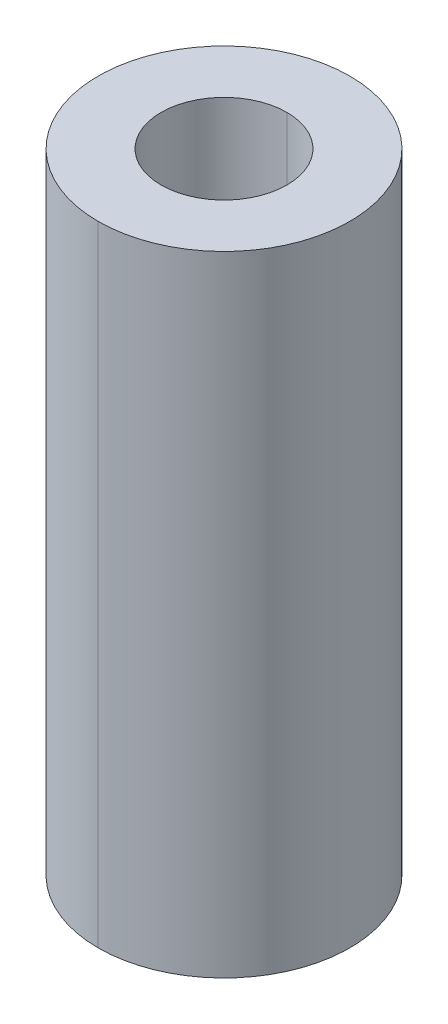
ISO-10303-21;
HEADER;
FILE_DESCRIPTION(('STEP AP214'),'2;1');
FILE_NAME('part.step','',(''),(''),'','','');
FILE_SCHEMA(('AUTOMOTIVE_DESIGN { 1 0 10303 214 1 1 1 1 }'));
ENDSEC;
DATA;
#1=APPLICATION_CONTEXT('core data for automotive mechanical design processes');
#2=APPLICATION_PROTOCOL_DEFINITION('international standard','automotive_design',2000,#1);
#3=PRODUCT_CONTEXT('',#1,'mechanical');
#4=PRODUCT('Part','Part','',(#3));
#5=PRODUCT_RELATED_PRODUCT_CATEGORY('part','',(#4));
#6=PRODUCT_DEFINITION_FORMATION('','',#4);
#7=PRODUCT_DEFINITION_CONTEXT('part definition',#1,'design');
#8=PRODUCT_DEFINITION('design','',#6,#7);
#9=PRODUCT_DEFINITION_SHAPE('','',#8);
#10=(LENGTH_UNIT() NAMED_UNIT(*) SI_UNIT(.MILLI.,.METRE.));
#11=(NAMED_UNIT(*) PLANE_ANGLE_UNIT() SI_UNIT($,.RADIAN.));
#12=(NAMED_UNIT(*) SI_UNIT($,.STERADIAN.) SOLID_ANGLE_UNIT());
#13=UNCERTAINTY_MEASURE_WITH_UNIT(LENGTH_MEASURE(1.E-05),#10,'distance_accuracy_value','');
#14=(GEOMETRIC_REPRESENTATION_CONTEXT(3) GLOBAL_UNCERTAINTY_ASSIGNED_CONTEXT((#13)) GLOBAL_UNIT_ASSIGNED_CONTEXT((#10,
#11,#12)) REPRESENTATION_CONTEXT('',''));
#15=CARTESIAN_POINT('',(0.,0.,0.));
#16=DIRECTION('',(0.,0.,1.));
#17=DIRECTION('',(1.,0.,0.));
#18=AXIS2_PLACEMENT_3D('',#15,#16,#17);
#19=CARTESIAN_POINT('',(0.,15.,0.));
#20=DIRECTION('',(0.,-1.,0.));
#21=DIRECTION('',(0.,0.,-1.));
#22=AXIS2_PLACEMENT_3D('',#19,#20,#21);
#23=CYLINDRICAL_SURFACE('',#22,1.5);
#24=DIRECTION('',(0.,-1.,0.));
#25=VECTOR('',#24,1.);
#26=CARTESIAN_POINT('',(0.,15.,1.5));
#27=LINE('',#26,#25);
#28=CARTESIAN_POINT('',(0.,15.,1.5));
#29=VERTEX_POINT('',#28);
#30=CARTESIAN_POINT('',(0.,0.,1.5));
#31=VERTEX_POINT('',#30);
#32=EDGE_CURVE('E77',#29,#31,#27,.T.);
#33=ORIENTED_EDGE('',*,*,#32,.F.);
#34=CARTESIAN_POINT('',(0.,15.,0.));
#35=DIRECTION('',(0.,1.,0.));
#36=DIRECTION('',(0.,0.,1.));
#37=AXIS2_PLACEMENT_3D('',#34,#35,#36);
#38=CIRCLE('',#37,1.5);
#39=CARTESIAN_POINT('',(0.,15.,-1.5));
#40=VERTEX_POINT('',#39);
#41=EDGE_CURVE('E72',#29,#40,#38,.T.);
#42=ORIENTED_EDGE('',*,*,#41,.T.);
#43=DIRECTION('',(0.,-1.,0.));
#44=VECTOR('',#43,1.);
#45=CARTESIAN_POINT('',(0.,15.,-1.5));
#46=LINE('',#45,#44);
#47=CARTESIAN_POINT('',(0.,0.,-1.5));
#48=VERTEX_POINT('',#47);
#49=EDGE_CURVE('E74',#40,#48,#46,.T.);
#50=ORIENTED_EDGE('',*,*,#49,.T.);
#51=CARTESIAN_POINT('',(0.,0.,0.));
#52=DIRECTION('',(0.,1.,0.));
#53=DIRECTION('',(0.,0.,1.));
#54=AXIS2_PLACEMENT_3D('',#51,#52,#53);
#55=CIRCLE('',#54,1.5);
#56=EDGE_CURVE('E11',#31,#48,#55,.T.);
#57=ORIENTED_EDGE('',*,*,#56,.F.);
#58=EDGE_LOOP('',(#33,#42,#50,#57));
#59=FACE_BOUND('',#58,.T.);
#60=ADVANCED_FACE('F18',(#59),#23,.F.);
#61=CARTESIAN_POINT('',(0.,15.,0.));
#62=DIRECTION('',(0.,-1.,0.));
#63=DIRECTION('',(0.,0.,-1.));
#64=AXIS2_PLACEMENT_3D('',#61,#62,#63);
#65=CYLINDRICAL_SURFACE('',#64,3.);
#66=DIRECTION('',(0.,-1.,0.));
#67=VECTOR('',#66,1.);
#68=CARTESIAN_POINT('',(0.,15.,3.));
#69=LINE('',#68,#67);
#70=CARTESIAN_POINT('',(0.,15.,3.));
#71=VERTEX_POINT('',#70);
#72=CARTESIAN_POINT('',(0.,0.,3.));
#73=VERTEX_POINT('',#72);
#74=EDGE_CURVE('E105',#71,#73,#69,.T.);
#75=ORIENTED_EDGE('',*,*,#74,.F.);
#76=CARTESIAN_POINT('',(0.,15.,0.));
#77=DIRECTION('',(0.,1.,0.));
#78=DIRECTION('',(0.,0.,1.));
#79=AXIS2_PLACEMENT_3D('',#76,#77,#78);
#80=CIRCLE('',#79,3.);
#81=CARTESIAN_POINT('',(0.,15.,-3.));
#82=VERTEX_POINT('',#81);
#83=EDGE_CURVE('E82',#82,#71,#80,.T.);
#84=ORIENTED_EDGE('',*,*,#83,.F.);
#85=DIRECTION('',(0.,-1.,0.));
#86=VECTOR('',#85,1.);
#87=CARTESIAN_POINT('',(0.,15.,-3.));
#88=LINE('',#87,#86);
#89=CARTESIAN_POINT('',(0.,0.,-3.));
#90=VERTEX_POINT('',#89);
#91=EDGE_CURVE('E104',#82,#90,#88,.T.);
#92=ORIENTED_EDGE('',*,*,#91,.T.);
#93=CARTESIAN_POINT('',(0.,0.,0.));
#94=DIRECTION('',(0.,1.,0.));
#95=DIRECTION('',(0.,0.,1.));
#96=AXIS2_PLACEMENT_3D('',#93,#94,#95);
#97=CIRCLE('',#96,3.);
#98=EDGE_CURVE('E26',#90,#73,#97,.T.);
#99=ORIENTED_EDGE('',*,*,#98,.T.);
#100=EDGE_LOOP('',(#75,#84,#92,#99));
#101=FACE_BOUND('',#100,.T.);
#102=ADVANCED_FACE('F123',(#101),#65,.T.);
#103=CARTESIAN_POINT('',(0.,0.,0.));
#104=DIRECTION('',(0.,1.,0.));
#105=DIRECTION('',(1.,0.,0.));
#106=AXIS2_PLACEMENT_3D('',#103,#104,#105);
#107=PLANE('',#106);
#108=CARTESIAN_POINT('',(0.,0.,0.));
#109=DIRECTION('',(0.,1.,0.));
#110=DIRECTION('',(0.,0.,1.));
#111=AXIS2_PLACEMENT_3D('',#108,#109,#110);
#112=CIRCLE('',#111,1.5);
#113=EDGE_CURVE('E87',#48,#31,#112,.T.);
#114=ORIENTED_EDGE('',*,*,#113,.T.);
#115=ORIENTED_EDGE('',*,*,#56,.T.);
#116=EDGE_LOOP('',(#114,#115));
#117=FACE_BOUND('',#116,.T.);
#118=ORIENTED_EDGE('',*,*,#98,.F.);
#119=CARTESIAN_POINT('',(0.,0.,0.));
#120=DIRECTION('',(0.,1.,0.));
#121=DIRECTION('',(0.,0.,1.));
#122=AXIS2_PLACEMENT_3D('',#119,#120,#121);
#123=CIRCLE('',#122,3.);
#124=EDGE_CURVE('E101',#73,#90,#123,.T.);
#125=ORIENTED_EDGE('',*,*,#124,.F.);
#126=EDGE_LOOP('',(#118,#125));
#127=FACE_BOUND('',#126,.T.);
#128=ADVANCED_FACE('F126',(#117,#127),#107,.F.);
#129=CARTESIAN_POINT('',(0.,15.,0.));
#130=DIRECTION('',(0.,1.,0.));
#131=DIRECTION('',(1.,0.,0.));
#132=AXIS2_PLACEMENT_3D('',#129,#130,#131);
#133=PLANE('',#132);
#134=CARTESIAN_POINT('',(0.,15.,0.));
#135=DIRECTION('',(0.,1.,0.));
#136=DIRECTION('',(0.,0.,1.));
#137=AXIS2_PLACEMENT_3D('',#134,#135,#136);
#138=CIRCLE('',#137,1.5);
#139=EDGE_CURVE('E85',#40,#29,#138,.T.);
#140=ORIENTED_EDGE('',*,*,#139,.F.);
#141=ORIENTED_EDGE('',*,*,#41,.F.);
#142=EDGE_LOOP('',(#140,#141));
#143=FACE_BOUND('',#142,.T.);
#144=ORIENTED_EDGE('',*,*,#83,.T.);
#145=CARTESIAN_POINT('',(0.,15.,0.));
#146=DIRECTION('',(0.,1.,0.));
#147=DIRECTION('',(0.,0.,1.));
#148=AXIS2_PLACEMENT_3D('',#145,#146,#147);
#149=CIRCLE('',#148,3.);
#150=EDGE_CURVE('E89',#71,#82,#149,.T.);
#151=ORIENTED_EDGE('',*,*,#150,.T.);
#152=EDGE_LOOP('',(#144,#151));
#153=FACE_BOUND('',#152,.T.);
#154=ADVANCED_FACE('F91',(#143,#153),#133,.T.);
#155=CARTESIAN_POINT('',(0.,15.,0.));
#156=DIRECTION('',(0.,-1.,0.));
#157=DIRECTION('',(0.,0.,-1.));
#158=AXIS2_PLACEMENT_3D('',#155,#156,#157);
#159=CYLINDRICAL_SURFACE('',#158,3.);
#160=ORIENTED_EDGE('',*,*,#150,.F.);
#161=ORIENTED_EDGE('',*,*,#74,.T.);
#162=ORIENTED_EDGE('',*,*,#124,.T.);
#163=ORIENTED_EDGE('',*,*,#91,.F.);
#164=EDGE_LOOP('',(#160,#161,#162,#163));
#165=FACE_BOUND('',#164,.T.);
#166=ADVANCED_FACE('F125',(#165),#159,.T.);
#167=CARTESIAN_POINT('',(0.,15.,0.));
#168=DIRECTION('',(0.,-1.,0.));
#169=DIRECTION('',(0.,0.,-1.));
#170=AXIS2_PLACEMENT_3D('',#167,#168,#169);
#171=CYLINDRICAL_SURFACE('',#170,1.5);
#172=ORIENTED_EDGE('',*,*,#139,.T.);
#173=ORIENTED_EDGE('',*,*,#32,.T.);
#174=ORIENTED_EDGE('',*,*,#113,.F.);
#175=ORIENTED_EDGE('',*,*,#49,.F.);
#176=EDGE_LOOP('',(#172,#173,#174,#175));
#177=FACE_BOUND('',#176,.T.);
#178=ADVANCED_FACE('F84',(#177),#171,.F.);
#179=CLOSED_SHELL('',(#60,#102,#128,#154,#166,#178));
#180=MANIFOLD_SOLID_BREP('B1',#179);
#181=ADVANCED_BREP_SHAPE_REPRESENTATION('',(#18,#180),#14);
#182=SHAPE_DEFINITION_REPRESENTATION(#9,#181);
ENDSEC;
END-ISO-10303-21;
